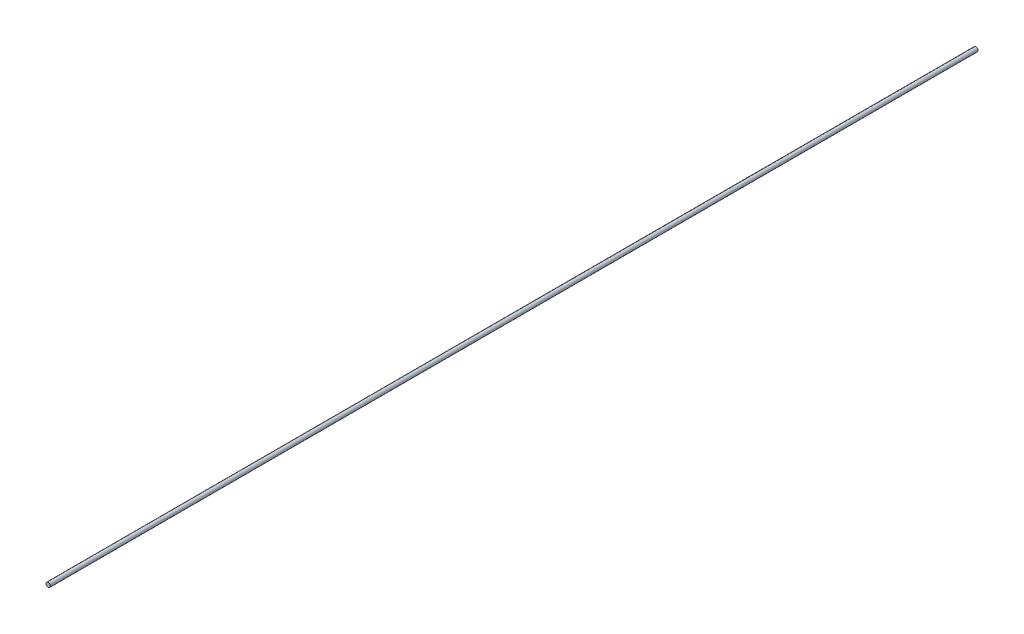
ISO-10303-21;
HEADER;
FILE_DESCRIPTION(('STEP AP214'),'2;1');
FILE_NAME('part.step','',(''),(''),'','','');
FILE_SCHEMA(('AUTOMOTIVE_DESIGN { 1 0 10303 214 1 1 1 1 }'));
ENDSEC;
DATA;
#1=APPLICATION_CONTEXT('core data for automotive mechanical design processes');
#2=APPLICATION_PROTOCOL_DEFINITION('international standard','automotive_design',2000,#1);
#3=PRODUCT_CONTEXT('',#1,'mechanical');
#4=PRODUCT('Part','Part','',(#3));
#5=PRODUCT_RELATED_PRODUCT_CATEGORY('part','',(#4));
#6=PRODUCT_DEFINITION_FORMATION('','',#4);
#7=PRODUCT_DEFINITION_CONTEXT('part definition',#1,'design');
#8=PRODUCT_DEFINITION('design','',#6,#7);
#9=PRODUCT_DEFINITION_SHAPE('','',#8);
#10=(LENGTH_UNIT() NAMED_UNIT(*) SI_UNIT(.MILLI.,.METRE.));
#11=(NAMED_UNIT(*) PLANE_ANGLE_UNIT() SI_UNIT($,.RADIAN.));
#12=(NAMED_UNIT(*) SI_UNIT($,.STERADIAN.) SOLID_ANGLE_UNIT());
#13=UNCERTAINTY_MEASURE_WITH_UNIT(LENGTH_MEASURE(1.E-05),#10,'distance_accuracy_value','');
#14=(GEOMETRIC_REPRESENTATION_CONTEXT(3) GLOBAL_UNCERTAINTY_ASSIGNED_CONTEXT((#13)) GLOBAL_UNIT_ASSIGNED_CONTEXT((#10,
#11,#12)) REPRESENTATION_CONTEXT('',''));
#15=CARTESIAN_POINT('',(0.,0.,0.));
#16=DIRECTION('',(0.,0.,1.));
#17=DIRECTION('',(1.,0.,0.));
#18=AXIS2_PLACEMENT_3D('',#15,#16,#17);
#19=CARTESIAN_POINT('',(0.,0.,1276.35));
#20=DIRECTION('',(0.,0.,-1.));
#21=DIRECTION('',(-1.,0.,0.));
#22=AXIS2_PLACEMENT_3D('',#19,#20,#21);
#23=CYLINDRICAL_SURFACE('',#22,3.);
#24=CARTESIAN_POINT('',(0.,0.,1276.35));
#25=DIRECTION('',(0.,0.,1.));
#26=DIRECTION('',(1.,0.,0.));
#27=AXIS2_PLACEMENT_3D('',#24,#25,#26);
#28=CIRCLE('',#27,3.);
#29=CARTESIAN_POINT('',(3.,0.,1276.35));
#30=VERTEX_POINT('',#29);
#31=EDGE_CURVE('E10',#30,#30,#28,.T.);
#32=ORIENTED_EDGE('',*,*,#31,.F.);
#33=EDGE_LOOP('',(#32));
#34=FACE_BOUND('',#33,.T.);
#35=CARTESIAN_POINT('',(0.,0.,0.));
#36=DIRECTION('',(0.,0.,1.));
#37=DIRECTION('',(1.,0.,0.));
#38=AXIS2_PLACEMENT_3D('',#35,#36,#37);
#39=CIRCLE('',#38,3.);
#40=CARTESIAN_POINT('',(3.,0.,0.));
#41=VERTEX_POINT('',#40);
#42=EDGE_CURVE('E33',#41,#41,#39,.T.);
#43=ORIENTED_EDGE('',*,*,#42,.T.);
#44=EDGE_LOOP('',(#43));
#45=FACE_BOUND('',#44,.T.);
#46=ADVANCED_FACE('F30',(#34,#45),#23,.T.);
#47=CARTESIAN_POINT('',(0.,0.,1276.35));
#48=DIRECTION('',(0.,0.,1.));
#49=DIRECTION('',(1.,0.,0.));
#50=AXIS2_PLACEMENT_3D('',#47,#48,#49);
#51=PLANE('',#50);
#52=ORIENTED_EDGE('',*,*,#31,.T.);
#53=EDGE_LOOP('',(#52));
#54=FACE_BOUND('',#53,.T.);
#55=ADVANCED_FACE('F45',(#54),#51,.T.);
#56=CARTESIAN_POINT('',(0.,0.,0.));
#57=DIRECTION('',(0.,0.,1.));
#58=DIRECTION('',(1.,0.,0.));
#59=AXIS2_PLACEMENT_3D('',#56,#57,#58);
#60=PLANE('',#59);
#61=ORIENTED_EDGE('',*,*,#42,.F.);
#62=EDGE_LOOP('',(#61));
#63=FACE_BOUND('',#62,.T.);
#64=ADVANCED_FACE('F43',(#63),#60,.F.);
#65=CLOSED_SHELL('',(#46,#55,#64));
#66=MANIFOLD_SOLID_BREP('B2',#65);
#67=ADVANCED_BREP_SHAPE_REPRESENTATION('',(#18,#66),#14);
#68=SHAPE_DEFINITION_REPRESENTATION(#9,#67);
ENDSEC;
END-ISO-10303-21;
